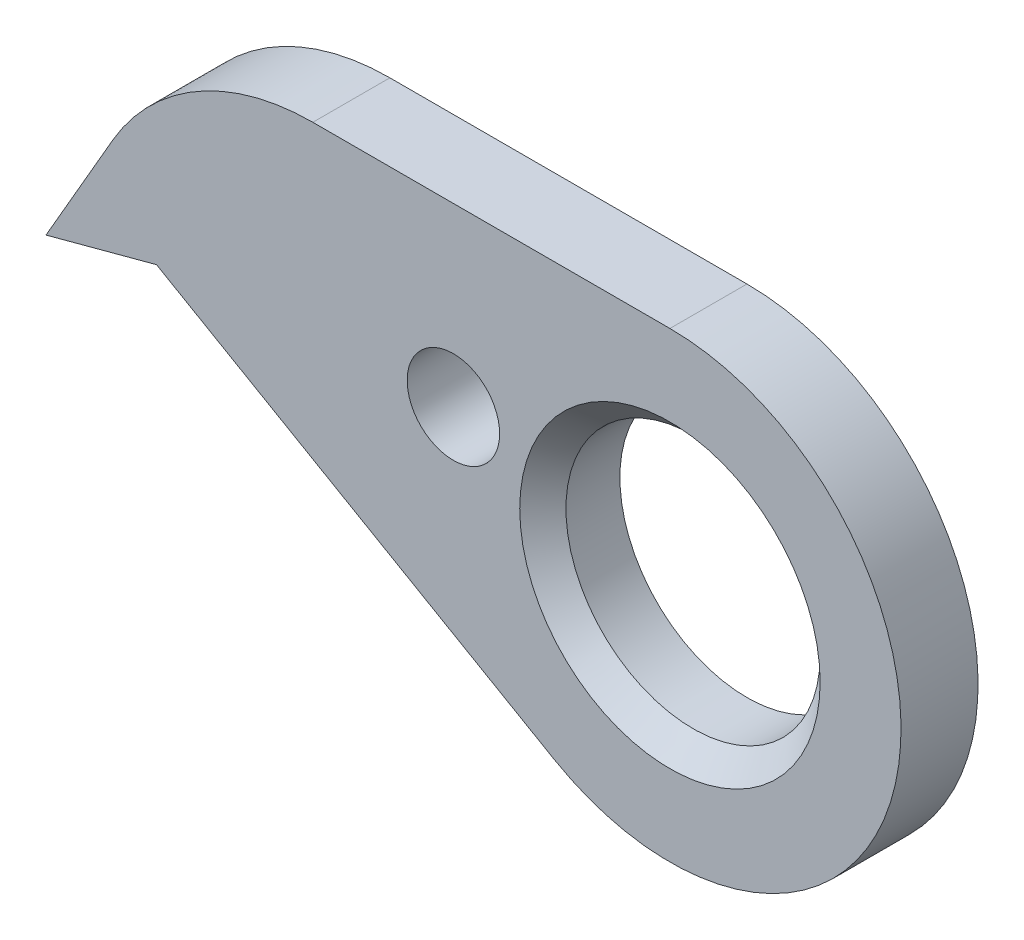
ISO-10303-21;
HEADER;
FILE_DESCRIPTION(('STEP AP214'),'2;1');
FILE_NAME('part.step','',(''),(''),'','','');
FILE_SCHEMA(('AUTOMOTIVE_DESIGN { 1 0 10303 214 1 1 1 1 }'));
ENDSEC;
DATA;
#1=APPLICATION_CONTEXT('core data for automotive mechanical design processes');
#2=APPLICATION_PROTOCOL_DEFINITION('international standard','automotive_design',2000,#1);
#3=PRODUCT_CONTEXT('',#1,'mechanical');
#4=PRODUCT('Part','Part','',(#3));
#5=PRODUCT_RELATED_PRODUCT_CATEGORY('part','',(#4));
#6=PRODUCT_DEFINITION_FORMATION('','',#4);
#7=PRODUCT_DEFINITION_CONTEXT('part definition',#1,'design');
#8=PRODUCT_DEFINITION('design','',#6,#7);
#9=PRODUCT_DEFINITION_SHAPE('','',#8);
#10=(LENGTH_UNIT() NAMED_UNIT(*) SI_UNIT(.MILLI.,.METRE.));
#11=(NAMED_UNIT(*) PLANE_ANGLE_UNIT() SI_UNIT($,.RADIAN.));
#12=(NAMED_UNIT(*) SI_UNIT($,.STERADIAN.) SOLID_ANGLE_UNIT());
#13=UNCERTAINTY_MEASURE_WITH_UNIT(LENGTH_MEASURE(1.E-05),#10,'distance_accuracy_value','');
#14=(GEOMETRIC_REPRESENTATION_CONTEXT(3) GLOBAL_UNCERTAINTY_ASSIGNED_CONTEXT((#13)) GLOBAL_UNIT_ASSIGNED_CONTEXT((#10,
#11,#12)) REPRESENTATION_CONTEXT('',''));
#15=CARTESIAN_POINT('',(0.,0.,0.));
#16=DIRECTION('',(0.,0.,1.));
#17=DIRECTION('',(1.,0.,0.));
#18=AXIS2_PLACEMENT_3D('',#15,#16,#17);
#19=CARTESIAN_POINT('',(0.,0.,-1.));
#20=DIRECTION('',(0.,0.,1.));
#21=DIRECTION('',(1.,0.,0.));
#22=AXIS2_PLACEMENT_3D('',#19,#20,#21);
#23=CYLINDRICAL_SURFACE('',#22,3.);
#24=CARTESIAN_POINT('',(0.,0.,0.));
#25=DIRECTION('',(0.,0.,1.));
#26=DIRECTION('',(1.,0.,0.));
#27=AXIS2_PLACEMENT_3D('',#24,#25,#26);
#28=CIRCLE('',#27,3.);
#29=CARTESIAN_POINT('',(-1.49999999999998,-2.59807621135332,0.));
#30=VERTEX_POINT('',#29);
#31=CARTESIAN_POINT('',(0.,3.,0.));
#32=VERTEX_POINT('',#31);
#33=EDGE_CURVE('E121',#30,#32,#28,.T.);
#34=ORIENTED_EDGE('',*,*,#33,.F.);
#35=DIRECTION('',(0.,0.,1.));
#36=VECTOR('',#35,1.);
#37=CARTESIAN_POINT('',(-1.49999999999998,-2.59807621135332,-1.));
#38=LINE('',#37,#36);
#39=CARTESIAN_POINT('',(-1.49999999999998,-2.59807621135332,-1.));
#40=VERTEX_POINT('',#39);
#41=EDGE_CURVE('E50',#40,#30,#38,.T.);
#42=ORIENTED_EDGE('',*,*,#41,.F.);
#43=CARTESIAN_POINT('',(0.,0.,-1.));
#44=DIRECTION('',(0.,0.,1.));
#45=DIRECTION('',(1.,0.,0.));
#46=AXIS2_PLACEMENT_3D('',#43,#44,#45);
#47=CIRCLE('',#46,3.);
#48=CARTESIAN_POINT('',(0.,3.,-1.));
#49=VERTEX_POINT('',#48);
#50=EDGE_CURVE('E137',#40,#49,#47,.T.);
#51=ORIENTED_EDGE('',*,*,#50,.T.);
#52=DIRECTION('',(0.,0.,1.));
#53=VECTOR('',#52,1.);
#54=CARTESIAN_POINT('',(0.,3.,-1.));
#55=LINE('',#54,#53);
#56=EDGE_CURVE('E85',#49,#32,#55,.T.);
#57=ORIENTED_EDGE('',*,*,#56,.T.);
#58=EDGE_LOOP('',(#34,#42,#51,#57));
#59=FACE_BOUND('',#58,.T.);
#60=ADVANCED_FACE('F33',(#59),#23,.T.);
#61=CARTESIAN_POINT('',(-6.66567332602638,0.38432667397364,-1.));
#62=DIRECTION('',(-0.499999999999995,-0.866025403784442,0.));
#63=DIRECTION('',(0.866025403784442,-0.499999999999995,0.));
#64=AXIS2_PLACEMENT_3D('',#61,#62,#63);
#65=PLANE('',#64);
#66=DIRECTION('',(0.866025403784442,-0.499999999999994,0.));
#67=VECTOR('',#66,1.);
#68=CARTESIAN_POINT('',(-6.66567332602638,0.38432667397364,0.));
#69=LINE('',#68,#67);
#70=CARTESIAN_POINT('',(-6.66567332602638,0.38432667397364,0.));
#71=VERTEX_POINT('',#70);
#72=EDGE_CURVE('E134',#71,#30,#69,.T.);
#73=ORIENTED_EDGE('',*,*,#72,.F.);
#74=DIRECTION('',(0.,0.,1.));
#75=VECTOR('',#74,1.);
#76=CARTESIAN_POINT('',(-6.66567332602638,0.38432667397364,-1.));
#77=LINE('',#76,#75);
#78=CARTESIAN_POINT('',(-6.66567332602638,0.38432667397364,-1.));
#79=VERTEX_POINT('',#78);
#80=EDGE_CURVE('E73',#79,#71,#77,.T.);
#81=ORIENTED_EDGE('',*,*,#80,.F.);
#82=DIRECTION('',(0.866025403784442,-0.499999999999994,0.));
#83=VECTOR('',#82,1.);
#84=CARTESIAN_POINT('',(-6.66567332602638,0.38432667397364,-1.));
#85=LINE('',#84,#83);
#86=EDGE_CURVE('E111',#79,#40,#85,.T.);
#87=ORIENTED_EDGE('',*,*,#86,.T.);
#88=ORIENTED_EDGE('',*,*,#41,.T.);
#89=EDGE_LOOP('',(#73,#81,#87,#88));
#90=FACE_BOUND('',#89,.T.);
#91=ADVANCED_FACE('F162',(#90),#65,.T.);
#92=CARTESIAN_POINT('',(-8.1,0.,-1.));
#93=DIRECTION('',(0.258819045102515,-0.96592582628907,0.));
#94=DIRECTION('',(0.96592582628907,0.258819045102515,0.));
#95=AXIS2_PLACEMENT_3D('',#92,#93,#94);
#96=PLANE('',#95);
#97=DIRECTION('',(0.96592582628907,0.258819045102515,0.));
#98=VECTOR('',#97,1.);
#99=CARTESIAN_POINT('',(-8.1,0.,0.));
#100=LINE('',#99,#98);
#101=CARTESIAN_POINT('',(-8.1,0.,0.));
#102=VERTEX_POINT('',#101);
#103=EDGE_CURVE('E98',#102,#71,#100,.T.);
#104=ORIENTED_EDGE('',*,*,#103,.F.);
#105=DIRECTION('',(0.,0.,1.));
#106=VECTOR('',#105,1.);
#107=CARTESIAN_POINT('',(-8.1,0.,-1.));
#108=LINE('',#107,#106);
#109=CARTESIAN_POINT('',(-8.1,0.,-1.));
#110=VERTEX_POINT('',#109);
#111=EDGE_CURVE('E93',#110,#102,#108,.T.);
#112=ORIENTED_EDGE('',*,*,#111,.F.);
#113=DIRECTION('',(0.96592582628907,0.258819045102515,0.));
#114=VECTOR('',#113,1.);
#115=CARTESIAN_POINT('',(-8.1,0.,-1.));
#116=LINE('',#115,#114);
#117=EDGE_CURVE('E96',#110,#79,#116,.T.);
#118=ORIENTED_EDGE('',*,*,#117,.T.);
#119=ORIENTED_EDGE('',*,*,#80,.T.);
#120=EDGE_LOOP('',(#104,#112,#118,#119));
#121=FACE_BOUND('',#120,.T.);
#122=ADVANCED_FACE('F95',(#121),#96,.T.);
#123=CARTESIAN_POINT('',(-8.1,0.,-1.));
#124=DIRECTION('',(-0.866025403784436,0.500000000000004,0.));
#125=DIRECTION('',(-0.500000000000004,-0.866025403784436,0.));
#126=AXIS2_PLACEMENT_3D('',#123,#124,#125);
#127=PLANE('',#126);
#128=DIRECTION('',(-0.500000000000004,-0.866025403784436,0.));
#129=VECTOR('',#128,1.);
#130=CARTESIAN_POINT('',(-8.1,0.,0.));
#131=LINE('',#130,#129);
#132=CARTESIAN_POINT('',(-7.23397459621554,1.50000000000001,0.));
#133=VERTEX_POINT('',#132);
#134=EDGE_CURVE('E131',#133,#102,#131,.T.);
#135=ORIENTED_EDGE('',*,*,#134,.F.);
#136=DIRECTION('',(0.,0.,1.));
#137=VECTOR('',#136,1.);
#138=CARTESIAN_POINT('',(-7.23397459621554,1.50000000000001,-1.));
#139=LINE('',#138,#137);
#140=CARTESIAN_POINT('',(-7.23397459621554,1.50000000000001,-1.));
#141=VERTEX_POINT('',#140);
#142=EDGE_CURVE('E103',#141,#133,#139,.T.);
#143=ORIENTED_EDGE('',*,*,#142,.F.);
#144=DIRECTION('',(-0.500000000000004,-0.866025403784436,0.));
#145=VECTOR('',#144,1.);
#146=CARTESIAN_POINT('',(-8.1,0.,-1.));
#147=LINE('',#146,#145);
#148=EDGE_CURVE('E109',#141,#110,#147,.T.);
#149=ORIENTED_EDGE('',*,*,#148,.T.);
#150=ORIENTED_EDGE('',*,*,#111,.T.);
#151=EDGE_LOOP('',(#135,#143,#149,#150));
#152=FACE_BOUND('',#151,.T.);
#153=ADVANCED_FACE('F113',(#152),#127,.T.);
#154=CARTESIAN_POINT('',(-4.63589838486224,0.,-1.));
#155=DIRECTION('',(0.,0.,1.));
#156=DIRECTION('',(1.,0.,0.));
#157=AXIS2_PLACEMENT_3D('',#154,#155,#156);
#158=CYLINDRICAL_SURFACE('',#157,3.);
#159=CARTESIAN_POINT('',(-4.63589838486224,0.,0.));
#160=DIRECTION('',(0.,0.,1.));
#161=DIRECTION('',(-1.,0.,0.));
#162=AXIS2_PLACEMENT_3D('',#159,#160,#161);
#163=CIRCLE('',#162,3.);
#164=CARTESIAN_POINT('',(-4.63589838486224,3.,0.));
#165=VERTEX_POINT('',#164);
#166=EDGE_CURVE('E128',#165,#133,#163,.T.);
#167=ORIENTED_EDGE('',*,*,#166,.F.);
#168=DIRECTION('',(0.,0.,1.));
#169=VECTOR('',#168,1.);
#170=CARTESIAN_POINT('',(-4.63589838486224,3.,-1.));
#171=LINE('',#170,#169);
#172=CARTESIAN_POINT('',(-4.63589838486224,3.,-1.));
#173=VERTEX_POINT('',#172);
#174=EDGE_CURVE('E141',#173,#165,#171,.T.);
#175=ORIENTED_EDGE('',*,*,#174,.F.);
#176=CARTESIAN_POINT('',(-4.63589838486224,0.,-1.));
#177=DIRECTION('',(0.,0.,1.));
#178=DIRECTION('',(-1.,0.,0.));
#179=AXIS2_PLACEMENT_3D('',#176,#177,#178);
#180=CIRCLE('',#179,3.);
#181=EDGE_CURVE('E114',#173,#141,#180,.T.);
#182=ORIENTED_EDGE('',*,*,#181,.T.);
#183=ORIENTED_EDGE('',*,*,#142,.T.);
#184=EDGE_LOOP('',(#167,#175,#182,#183));
#185=FACE_BOUND('',#184,.T.);
#186=ADVANCED_FACE('F171',(#185),#158,.T.);
#187=CARTESIAN_POINT('',(0.,3.,-1.));
#188=DIRECTION('',(0.,1.,0.));
#189=DIRECTION('',(-1.,0.,0.));
#190=AXIS2_PLACEMENT_3D('',#187,#188,#189);
#191=PLANE('',#190);
#192=DIRECTION('',(-1.,0.,0.));
#193=VECTOR('',#192,1.);
#194=CARTESIAN_POINT('',(0.,3.,0.));
#195=LINE('',#194,#193);
#196=EDGE_CURVE('E124',#32,#165,#195,.T.);
#197=ORIENTED_EDGE('',*,*,#196,.F.);
#198=ORIENTED_EDGE('',*,*,#56,.F.);
#199=DIRECTION('',(-1.,0.,0.));
#200=VECTOR('',#199,1.);
#201=CARTESIAN_POINT('',(0.,3.,-1.));
#202=LINE('',#201,#200);
#203=EDGE_CURVE('E116',#49,#173,#202,.T.);
#204=ORIENTED_EDGE('',*,*,#203,.T.);
#205=ORIENTED_EDGE('',*,*,#174,.T.);
#206=EDGE_LOOP('',(#197,#198,#204,#205));
#207=FACE_BOUND('',#206,.T.);
#208=ADVANCED_FACE('F168',(#207),#191,.T.);
#209=CARTESIAN_POINT('',(0.,0.,-1.));
#210=DIRECTION('',(0.,0.,1.));
#211=DIRECTION('',(1.,0.,0.));
#212=AXIS2_PLACEMENT_3D('',#209,#210,#211);
#213=PLANE('',#212);
#214=CARTESIAN_POINT('',(-2.81138913942402,0.711400805965721,-1.));
#215=DIRECTION('',(0.,0.,1.));
#216=DIRECTION('',(1.,0.,0.));
#217=AXIS2_PLACEMENT_3D('',#214,#215,#216);
#218=CIRCLE('',#217,0.599999999999999);
#219=CARTESIAN_POINT('',(-2.21138913942402,0.711400805965721,-1.));
#220=VERTEX_POINT('',#219);
#221=EDGE_CURVE('E189',#220,#220,#218,.T.);
#222=ORIENTED_EDGE('',*,*,#221,.T.);
#223=EDGE_LOOP('',(#222));
#224=FACE_BOUND('',#223,.T.);
#225=CARTESIAN_POINT('',(0.,0.,-1.));
#226=DIRECTION('',(0.,0.,1.));
#227=DIRECTION('',(1.,0.,0.));
#228=AXIS2_PLACEMENT_3D('',#225,#226,#227);
#229=CIRCLE('',#228,1.65);
#230=CARTESIAN_POINT('',(1.65,0.,-1.));
#231=VERTEX_POINT('',#230);
#232=EDGE_CURVE('E125',#231,#231,#229,.F.);
#233=ORIENTED_EDGE('',*,*,#232,.F.);
#234=EDGE_LOOP('',(#233));
#235=FACE_BOUND('',#234,.T.);
#236=ORIENTED_EDGE('',*,*,#50,.F.);
#237=ORIENTED_EDGE('',*,*,#86,.F.);
#238=ORIENTED_EDGE('',*,*,#117,.F.);
#239=ORIENTED_EDGE('',*,*,#148,.F.);
#240=ORIENTED_EDGE('',*,*,#181,.F.);
#241=ORIENTED_EDGE('',*,*,#203,.F.);
#242=EDGE_LOOP('',(#236,#237,#238,#239,#240,#241));
#243=FACE_BOUND('',#242,.T.);
#244=ADVANCED_FACE('F107',(#224,#235,#243),#213,.F.);
#245=CARTESIAN_POINT('',(0.,0.,0.));
#246=DIRECTION('',(0.,0.,1.));
#247=DIRECTION('',(1.,0.,0.));
#248=AXIS2_PLACEMENT_3D('',#245,#246,#247);
#249=PLANE('',#248);
#250=CARTESIAN_POINT('',(-2.81138913942402,0.711400805965721,0.));
#251=DIRECTION('',(0.,0.,1.));
#252=DIRECTION('',(1.,0.,0.));
#253=AXIS2_PLACEMENT_3D('',#250,#251,#252);
#254=CIRCLE('',#253,0.599999999999999);
#255=CARTESIAN_POINT('',(-2.21138913942402,0.711400805965721,0.));
#256=VERTEX_POINT('',#255);
#257=EDGE_CURVE('E193',#256,#256,#254,.T.);
#258=ORIENTED_EDGE('',*,*,#257,.F.);
#259=EDGE_LOOP('',(#258));
#260=FACE_BOUND('',#259,.T.);
#261=CARTESIAN_POINT('',(0.,0.,0.));
#262=DIRECTION('',(0.,0.,1.));
#263=DIRECTION('',(1.,0.,0.));
#264=AXIS2_PLACEMENT_3D('',#261,#262,#263);
#265=CIRCLE('',#264,1.95);
#266=CARTESIAN_POINT('',(1.95,0.,0.));
#267=VERTEX_POINT('',#266);
#268=EDGE_CURVE('E11',#267,#267,#265,.F.);
#269=ORIENTED_EDGE('',*,*,#268,.T.);
#270=EDGE_LOOP('',(#269));
#271=FACE_BOUND('',#270,.T.);
#272=ORIENTED_EDGE('',*,*,#33,.T.);
#273=ORIENTED_EDGE('',*,*,#196,.T.);
#274=ORIENTED_EDGE('',*,*,#166,.T.);
#275=ORIENTED_EDGE('',*,*,#134,.T.);
#276=ORIENTED_EDGE('',*,*,#103,.T.);
#277=ORIENTED_EDGE('',*,*,#72,.T.);
#278=EDGE_LOOP('',(#272,#273,#274,#275,#276,#277));
#279=FACE_BOUND('',#278,.T.);
#280=ADVANCED_FACE('F158',(#260,#271,#279),#249,.T.);
#281=CARTESIAN_POINT('',(0.,0.,-1.001));
#282=DIRECTION('',(0.,0.,1.));
#283=DIRECTION('',(1.,0.,0.));
#284=AXIS2_PLACEMENT_3D('',#281,#282,#283);
#285=CYLINDRICAL_SURFACE('',#284,1.65);
#286=CARTESIAN_POINT('',(0.,0.,-0.299999999999999));
#287=DIRECTION('',(0.,0.,1.));
#288=DIRECTION('',(1.,0.,0.));
#289=AXIS2_PLACEMENT_3D('',#286,#287,#288);
#290=CIRCLE('',#289,1.65);
#291=CARTESIAN_POINT('',(1.65,0.,-0.299999999999999));
#292=VERTEX_POINT('',#291);
#293=EDGE_CURVE('E42',#292,#292,#290,.T.);
#294=ORIENTED_EDGE('',*,*,#293,.T.);
#295=EDGE_LOOP('',(#294));
#296=FACE_BOUND('',#295,.T.);
#297=ORIENTED_EDGE('',*,*,#232,.T.);
#298=EDGE_LOOP('',(#297));
#299=FACE_BOUND('',#298,.T.);
#300=ADVANCED_FACE('F146',(#296,#299),#285,.F.);
#301=CARTESIAN_POINT('',(0.,0.,-0.299999999999999));
#302=DIRECTION('',(0.,0.,1.));
#303=DIRECTION('',(1.,0.,0.));
#304=AXIS2_PLACEMENT_3D('',#301,#302,#303);
#305=CONICAL_SURFACE('',#304,1.65,0.78539816339745);
#306=ORIENTED_EDGE('',*,*,#268,.F.);
#307=EDGE_LOOP('',(#306));
#308=FACE_BOUND('',#307,.T.);
#309=ORIENTED_EDGE('',*,*,#293,.F.);
#310=EDGE_LOOP('',(#309));
#311=FACE_BOUND('',#310,.T.);
#312=ADVANCED_FACE('F35',(#308,#311),#305,.F.);
#313=CARTESIAN_POINT('',(-2.81138913942402,0.711400805965721,0.));
#314=DIRECTION('',(0.,0.,1.));
#315=DIRECTION('',(1.,0.,0.));
#316=AXIS2_PLACEMENT_3D('',#313,#314,#315);
#317=CYLINDRICAL_SURFACE('',#316,0.599999999999999);
#318=ORIENTED_EDGE('',*,*,#221,.F.);
#319=EDGE_LOOP('',(#318));
#320=FACE_BOUND('',#319,.T.);
#321=ORIENTED_EDGE('',*,*,#257,.T.);
#322=EDGE_LOOP('',(#321));
#323=FACE_BOUND('',#322,.T.);
#324=ADVANCED_FACE('F150',(#320,#323),#317,.F.);
#325=CLOSED_SHELL('',(#60,#91,#122,#153,#186,#208,#244,#280,#300,#312,#324));
#326=MANIFOLD_SOLID_BREP('B2',#325);
#327=ADVANCED_BREP_SHAPE_REPRESENTATION('',(#18,#326),#14);
#328=SHAPE_DEFINITION_REPRESENTATION(#9,#327);
ENDSEC;
END-ISO-10303-21;
